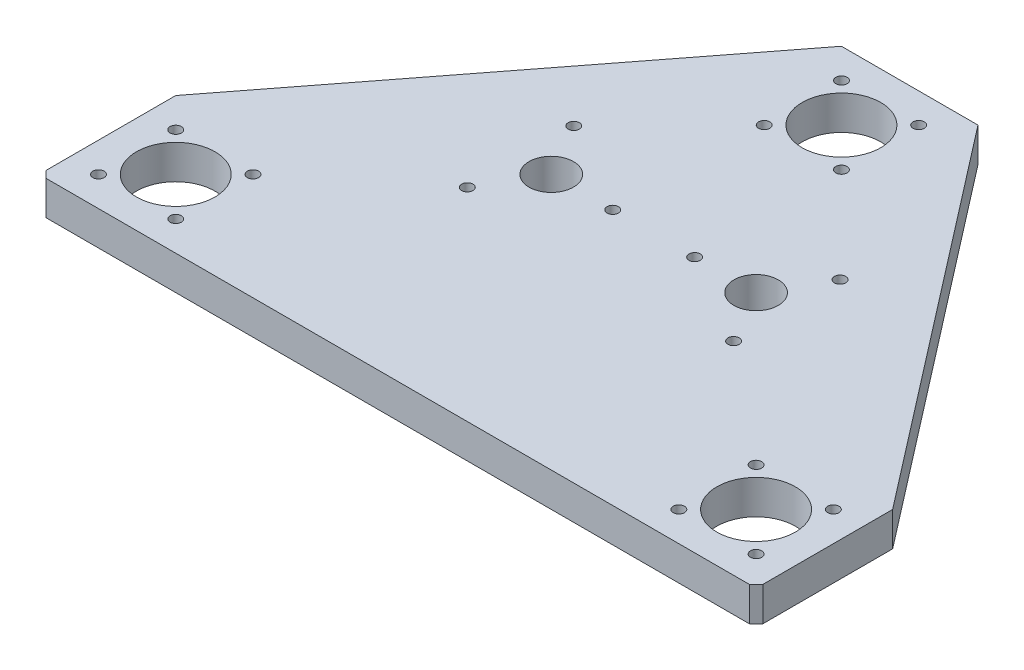
ISO-10303-21;
HEADER;
FILE_DESCRIPTION(('STEP AP214'),'2;1');
FILE_NAME('part.step','',(''),(''),'','','');
FILE_SCHEMA(('AUTOMOTIVE_DESIGN { 1 0 10303 214 1 1 1 1 }'));
ENDSEC;
DATA;
#1=APPLICATION_CONTEXT('core data for automotive mechanical design processes');
#2=APPLICATION_PROTOCOL_DEFINITION('international standard','automotive_design',2000,#1);
#3=PRODUCT_CONTEXT('',#1,'mechanical');
#4=PRODUCT('Part','Part','',(#3));
#5=PRODUCT_RELATED_PRODUCT_CATEGORY('part','',(#4));
#6=PRODUCT_DEFINITION_FORMATION('','',#4);
#7=PRODUCT_DEFINITION_CONTEXT('part definition',#1,'design');
#8=PRODUCT_DEFINITION('design','',#6,#7);
#9=PRODUCT_DEFINITION_SHAPE('','',#8);
#10=(LENGTH_UNIT() NAMED_UNIT(*) SI_UNIT(.MILLI.,.METRE.));
#11=(NAMED_UNIT(*) PLANE_ANGLE_UNIT() SI_UNIT($,.RADIAN.));
#12=(NAMED_UNIT(*) SI_UNIT($,.STERADIAN.) SOLID_ANGLE_UNIT());
#13=UNCERTAINTY_MEASURE_WITH_UNIT(LENGTH_MEASURE(1.E-05),#10,'distance_accuracy_value','');
#14=(GEOMETRIC_REPRESENTATION_CONTEXT(3) GLOBAL_UNCERTAINTY_ASSIGNED_CONTEXT((#13)) GLOBAL_UNIT_ASSIGNED_CONTEXT((#10,
#11,#12)) REPRESENTATION_CONTEXT('',''));
#15=CARTESIAN_POINT('',(0.,0.,0.));
#16=DIRECTION('',(0.,0.,1.));
#17=DIRECTION('',(1.,0.,0.));
#18=AXIS2_PLACEMENT_3D('',#15,#16,#17);
#19=CARTESIAN_POINT('',(0.,10.,0.));
#20=DIRECTION('',(0.,1.,0.));
#21=DIRECTION('',(0.,0.,1.));
#22=AXIS2_PLACEMENT_3D('',#19,#20,#21);
#23=PLANE('',#22);
#24=CARTESIAN_POINT('',(38.9999999999999,10.,-15.58845726812));
#25=DIRECTION('',(0.,1.,0.));
#26=DIRECTION('',(0.,0.,1.));
#27=AXIS2_PLACEMENT_3D('',#24,#25,#26);
#28=CIRCLE('',#27,1.64999999999999);
#29=CARTESIAN_POINT('',(38.9999999999999,10.,-13.93845726812));
#30=VERTEX_POINT('',#29);
#31=EDGE_CURVE('E301',#30,#30,#28,.T.);
#32=ORIENTED_EDGE('',*,*,#31,.F.);
#33=EDGE_LOOP('',(#32));
#34=FACE_BOUND('',#33,.T.);
#35=CARTESIAN_POINT('',(39.0000000000001,10.,15.5884572681199));
#36=DIRECTION('',(0.,1.,0.));
#37=DIRECTION('',(0.,0.,1.));
#38=AXIS2_PLACEMENT_3D('',#35,#36,#37);
#39=CIRCLE('',#38,1.64999999999999);
#40=CARTESIAN_POINT('',(39.0000000000001,10.,17.2384572681199));
#41=VERTEX_POINT('',#40);
#42=EDGE_CURVE('E303',#41,#41,#39,.T.);
#43=ORIENTED_EDGE('',*,*,#42,.F.);
#44=EDGE_LOOP('',(#43));
#45=FACE_BOUND('',#44,.T.);
#46=CARTESIAN_POINT('',(12.,10.,0.));
#47=DIRECTION('',(0.,1.,0.));
#48=DIRECTION('',(0.,0.,1.));
#49=AXIS2_PLACEMENT_3D('',#46,#47,#48);
#50=CIRCLE('',#49,1.64999999999999);
#51=CARTESIAN_POINT('',(12.,10.,1.64999999999999));
#52=VERTEX_POINT('',#51);
#53=EDGE_CURVE('E311',#52,#52,#50,.T.);
#54=ORIENTED_EDGE('',*,*,#53,.F.);
#55=EDGE_LOOP('',(#54));
#56=FACE_BOUND('',#55,.T.);
#57=CARTESIAN_POINT('',(96.3137084989848,10.,43.6862915010152));
#58=DIRECTION('',(0.,1.,0.));
#59=DIRECTION('',(0.,0.,1.));
#60=AXIS2_PLACEMENT_3D('',#57,#58,#59);
#61=CIRCLE('',#60,1.65);
#62=CARTESIAN_POINT('',(96.3137084989848,10.,45.3362915010152));
#63=VERTEX_POINT('',#62);
#64=EDGE_CURVE('E317',#63,#63,#61,.T.);
#65=ORIENTED_EDGE('',*,*,#64,.F.);
#66=EDGE_LOOP('',(#65));
#67=FACE_BOUND('',#66,.T.);
#68=CARTESIAN_POINT('',(73.6862915010153,10.,43.6862915010152));
#69=DIRECTION('',(0.,1.,0.));
#70=DIRECTION('',(0.,0.,1.));
#71=AXIS2_PLACEMENT_3D('',#68,#69,#70);
#72=CIRCLE('',#71,1.65);
#73=CARTESIAN_POINT('',(73.6862915010153,10.,45.3362915010152));
#74=VERTEX_POINT('',#73);
#75=EDGE_CURVE('E323',#74,#74,#72,.T.);
#76=ORIENTED_EDGE('',*,*,#75,.F.);
#77=EDGE_LOOP('',(#76));
#78=FACE_BOUND('',#77,.T.);
#79=CARTESIAN_POINT('',(73.6862915010153,10.,66.3137084989848));
#80=DIRECTION('',(0.,1.,0.));
#81=DIRECTION('',(0.,0.,1.));
#82=AXIS2_PLACEMENT_3D('',#79,#80,#81);
#83=CIRCLE('',#82,1.65);
#84=CARTESIAN_POINT('',(73.6862915010153,10.,67.9637084989848));
#85=VERTEX_POINT('',#84);
#86=EDGE_CURVE('E329',#85,#85,#83,.T.);
#87=ORIENTED_EDGE('',*,*,#86,.F.);
#88=EDGE_LOOP('',(#87));
#89=FACE_BOUND('',#88,.T.);
#90=CARTESIAN_POINT('',(96.3137084989848,10.,66.3137084989848));
#91=DIRECTION('',(0.,1.,0.));
#92=DIRECTION('',(0.,0.,1.));
#93=AXIS2_PLACEMENT_3D('',#90,#91,#92);
#94=CIRCLE('',#93,1.65);
#95=CARTESIAN_POINT('',(96.3137084989848,10.,67.9637084989848));
#96=VERTEX_POINT('',#95);
#97=EDGE_CURVE('E335',#96,#96,#94,.T.);
#98=ORIENTED_EDGE('',*,*,#97,.F.);
#99=EDGE_LOOP('',(#98));
#100=FACE_BOUND('',#99,.T.);
#101=CARTESIAN_POINT('',(11.3137084989848,10.,-43.6862915010153));
#102=DIRECTION('',(0.,1.,0.));
#103=DIRECTION('',(0.,0.,1.));
#104=AXIS2_PLACEMENT_3D('',#101,#102,#103);
#105=CIRCLE('',#104,1.65);
#106=CARTESIAN_POINT('',(11.3137084989848,10.,-42.0362915010153));
#107=VERTEX_POINT('',#106);
#108=EDGE_CURVE('E341',#107,#107,#105,.T.);
#109=ORIENTED_EDGE('',*,*,#108,.F.);
#110=EDGE_LOOP('',(#109));
#111=FACE_BOUND('',#110,.T.);
#112=CARTESIAN_POINT('',(11.3137084989848,10.,-66.3137084989848));
#113=DIRECTION('',(0.,1.,0.));
#114=DIRECTION('',(0.,0.,1.));
#115=AXIS2_PLACEMENT_3D('',#112,#113,#114);
#116=CIRCLE('',#115,1.65);
#117=CARTESIAN_POINT('',(11.3137084989848,10.,-64.6637084989848));
#118=VERTEX_POINT('',#117);
#119=EDGE_CURVE('E347',#118,#118,#116,.T.);
#120=ORIENTED_EDGE('',*,*,#119,.F.);
#121=EDGE_LOOP('',(#120));
#122=FACE_BOUND('',#121,.T.);
#123=CARTESIAN_POINT('',(-38.9999999999999,10.,-15.58845726812));
#124=DIRECTION('',(0.,1.,0.));
#125=DIRECTION('',(0.,0.,1.));
#126=AXIS2_PLACEMENT_3D('',#123,#124,#125);
#127=CIRCLE('',#126,1.64999999999999);
#128=CARTESIAN_POINT('',(-38.9999999999999,10.,-13.93845726812));
#129=VERTEX_POINT('',#128);
#130=EDGE_CURVE('E353',#129,#129,#127,.T.);
#131=ORIENTED_EDGE('',*,*,#130,.F.);
#132=EDGE_LOOP('',(#131));
#133=FACE_BOUND('',#132,.T.);
#134=CARTESIAN_POINT('',(-39.0000000000001,10.,15.5884572681199));
#135=DIRECTION('',(0.,1.,0.));
#136=DIRECTION('',(0.,0.,1.));
#137=AXIS2_PLACEMENT_3D('',#134,#135,#136);
#138=CIRCLE('',#137,1.64999999999999);
#139=CARTESIAN_POINT('',(-39.0000000000001,10.,17.2384572681199));
#140=VERTEX_POINT('',#139);
#141=EDGE_CURVE('E359',#140,#140,#138,.T.);
#142=ORIENTED_EDGE('',*,*,#141,.F.);
#143=EDGE_LOOP('',(#142));
#144=FACE_BOUND('',#143,.T.);
#145=CARTESIAN_POINT('',(-12.,10.,0.));
#146=DIRECTION('',(0.,1.,0.));
#147=DIRECTION('',(0.,0.,1.));
#148=AXIS2_PLACEMENT_3D('',#145,#146,#147);
#149=CIRCLE('',#148,1.64999999999999);
#150=CARTESIAN_POINT('',(-12.,10.,1.64999999999999));
#151=VERTEX_POINT('',#150);
#152=EDGE_CURVE('E365',#151,#151,#149,.T.);
#153=ORIENTED_EDGE('',*,*,#152,.F.);
#154=EDGE_LOOP('',(#153));
#155=FACE_BOUND('',#154,.T.);
#156=CARTESIAN_POINT('',(-96.3137084989848,10.,43.6862915010152));
#157=DIRECTION('',(0.,1.,0.));
#158=DIRECTION('',(0.,0.,1.));
#159=AXIS2_PLACEMENT_3D('',#156,#157,#158);
#160=CIRCLE('',#159,1.65);
#161=CARTESIAN_POINT('',(-96.3137084989848,10.,45.3362915010152));
#162=VERTEX_POINT('',#161);
#163=EDGE_CURVE('E371',#162,#162,#160,.T.);
#164=ORIENTED_EDGE('',*,*,#163,.F.);
#165=EDGE_LOOP('',(#164));
#166=FACE_BOUND('',#165,.T.);
#167=CARTESIAN_POINT('',(-73.6862915010153,10.,43.6862915010152));
#168=DIRECTION('',(0.,1.,0.));
#169=DIRECTION('',(0.,0.,1.));
#170=AXIS2_PLACEMENT_3D('',#167,#168,#169);
#171=CIRCLE('',#170,1.65);
#172=CARTESIAN_POINT('',(-73.6862915010153,10.,45.3362915010152));
#173=VERTEX_POINT('',#172);
#174=EDGE_CURVE('E377',#173,#173,#171,.T.);
#175=ORIENTED_EDGE('',*,*,#174,.F.);
#176=EDGE_LOOP('',(#175));
#177=FACE_BOUND('',#176,.T.);
#178=CARTESIAN_POINT('',(-73.6862915010153,10.,66.3137084989848));
#179=DIRECTION('',(0.,1.,0.));
#180=DIRECTION('',(0.,0.,1.));
#181=AXIS2_PLACEMENT_3D('',#178,#179,#180);
#182=CIRCLE('',#181,1.65);
#183=CARTESIAN_POINT('',(-73.6862915010153,10.,67.9637084989848));
#184=VERTEX_POINT('',#183);
#185=EDGE_CURVE('E383',#184,#184,#182,.T.);
#186=ORIENTED_EDGE('',*,*,#185,.F.);
#187=EDGE_LOOP('',(#186));
#188=FACE_BOUND('',#187,.T.);
#189=CARTESIAN_POINT('',(-96.3137084989848,10.,66.3137084989848));
#190=DIRECTION('',(0.,1.,0.));
#191=DIRECTION('',(0.,0.,1.));
#192=AXIS2_PLACEMENT_3D('',#189,#190,#191);
#193=CIRCLE('',#192,1.65);
#194=CARTESIAN_POINT('',(-96.3137084989848,10.,67.9637084989848));
#195=VERTEX_POINT('',#194);
#196=EDGE_CURVE('E389',#195,#195,#193,.T.);
#197=ORIENTED_EDGE('',*,*,#196,.F.);
#198=EDGE_LOOP('',(#197));
#199=FACE_BOUND('',#198,.T.);
#200=CARTESIAN_POINT('',(-11.3137084989848,10.,-43.6862915010153));
#201=DIRECTION('',(0.,1.,0.));
#202=DIRECTION('',(0.,0.,1.));
#203=AXIS2_PLACEMENT_3D('',#200,#201,#202);
#204=CIRCLE('',#203,1.65);
#205=CARTESIAN_POINT('',(-11.3137084989848,10.,-42.0362915010153));
#206=VERTEX_POINT('',#205);
#207=EDGE_CURVE('E395',#206,#206,#204,.T.);
#208=ORIENTED_EDGE('',*,*,#207,.F.);
#209=EDGE_LOOP('',(#208));
#210=FACE_BOUND('',#209,.T.);
#211=CARTESIAN_POINT('',(-11.3137084989848,10.,-66.3137084989848));
#212=DIRECTION('',(0.,1.,0.));
#213=DIRECTION('',(0.,0.,1.));
#214=AXIS2_PLACEMENT_3D('',#211,#212,#213);
#215=CIRCLE('',#214,1.65);
#216=CARTESIAN_POINT('',(-11.3137084989848,10.,-64.6637084989848));
#217=VERTEX_POINT('',#216);
#218=EDGE_CURVE('E401',#217,#217,#215,.T.);
#219=ORIENTED_EDGE('',*,*,#218,.F.);
#220=EDGE_LOOP('',(#219));
#221=FACE_BOUND('',#220,.T.);
#222=CARTESIAN_POINT('',(85.,10.,55.));
#223=DIRECTION('',(0.,1.,0.));
#224=DIRECTION('',(0.,0.,1.));
#225=AXIS2_PLACEMENT_3D('',#222,#223,#224);
#226=CIRCLE('',#225,11.5);
#227=CARTESIAN_POINT('',(85.,10.,66.5));
#228=VERTEX_POINT('',#227);
#229=EDGE_CURVE('E414',#228,#228,#226,.T.);
#230=ORIENTED_EDGE('',*,*,#229,.F.);
#231=EDGE_LOOP('',(#230));
#232=FACE_BOUND('',#231,.T.);
#233=CARTESIAN_POINT('',(30.,10.,0.));
#234=DIRECTION('',(0.,1.,0.));
#235=DIRECTION('',(0.,0.,1.));
#236=AXIS2_PLACEMENT_3D('',#233,#234,#235);
#237=CIRCLE('',#236,6.5);
#238=CARTESIAN_POINT('',(30.,10.,6.5));
#239=VERTEX_POINT('',#238);
#240=EDGE_CURVE('E426',#239,#239,#237,.T.);
#241=ORIENTED_EDGE('',*,*,#240,.F.);
#242=EDGE_LOOP('',(#241));
#243=FACE_BOUND('',#242,.T.);
#244=DIRECTION('',(1.,0.,0.));
#245=VECTOR('',#244,1.);
#246=CARTESIAN_POINT('',(-65.,10.,75.));
#247=LINE('',#246,#245);
#248=CARTESIAN_POINT('',(-103.,10.,75.));
#249=VERTEX_POINT('',#248);
#250=CARTESIAN_POINT('',(103.,10.,75.));
#251=VERTEX_POINT('',#250);
#252=EDGE_CURVE('E112',#249,#251,#247,.T.);
#253=ORIENTED_EDGE('',*,*,#252,.T.);
#254=DIRECTION('',(-0.707106781186552,0.,0.707106781186543));
#255=VECTOR('',#254,1.);
#256=CARTESIAN_POINT('',(88.9999999999993,10.,89.0000000000005));
#257=LINE('',#256,#255);
#258=CARTESIAN_POINT('',(105.,10.,73.));
#259=VERTEX_POINT('',#258);
#260=EDGE_CURVE('E44',#251,#259,#257,.F.);
#261=ORIENTED_EDGE('',*,*,#260,.T.);
#262=DIRECTION('',(0.,0.,-1.));
#263=VECTOR('',#262,1.);
#264=CARTESIAN_POINT('',(105.,10.,75.));
#265=LINE('',#264,#263);
#266=CARTESIAN_POINT('',(105.,10.,35.));
#267=VERTEX_POINT('',#266);
#268=EDGE_CURVE('E102',#259,#267,#265,.T.);
#269=ORIENTED_EDGE('',*,*,#268,.T.);
#270=DIRECTION('',(-0.611447501075765,0.,-0.791285001392167));
#271=VECTOR('',#270,1.);
#272=CARTESIAN_POINT('',(20.,10.,-75.));
#273=LINE('',#272,#271);
#274=CARTESIAN_POINT('',(20.,10.,-75.));
#275=VERTEX_POINT('',#274);
#276=EDGE_CURVE('E106',#267,#275,#273,.T.);
#277=ORIENTED_EDGE('',*,*,#276,.T.);
#278=DIRECTION('',(-1.,0.,0.));
#279=VECTOR('',#278,1.);
#280=CARTESIAN_POINT('',(20.,10.,-75.));
#281=LINE('',#280,#279);
#282=CARTESIAN_POINT('',(-20.,10.,-75.));
#283=VERTEX_POINT('',#282);
#284=EDGE_CURVE('E127',#275,#283,#281,.T.);
#285=ORIENTED_EDGE('',*,*,#284,.T.);
#286=DIRECTION('',(-0.611447501075766,0.,0.791285001392167));
#287=VECTOR('',#286,1.);
#288=CARTESIAN_POINT('',(-105.,10.,35.));
#289=LINE('',#288,#287);
#290=CARTESIAN_POINT('',(-105.,10.,35.));
#291=VERTEX_POINT('',#290);
#292=EDGE_CURVE('E129',#283,#291,#289,.T.);
#293=ORIENTED_EDGE('',*,*,#292,.T.);
#294=DIRECTION('',(0.,0.,1.));
#295=VECTOR('',#294,1.);
#296=CARTESIAN_POINT('',(-105.,10.,75.));
#297=LINE('',#296,#295);
#298=CARTESIAN_POINT('',(-105.,10.,73.));
#299=VERTEX_POINT('',#298);
#300=EDGE_CURVE('E147',#291,#299,#297,.T.);
#301=ORIENTED_EDGE('',*,*,#300,.T.);
#302=DIRECTION('',(-0.707106781186543,0.,-0.707106781186552));
#303=VECTOR('',#302,1.);
#304=CARTESIAN_POINT('',(-89.0000000000007,10.,88.9999999999995));
#305=LINE('',#304,#303);
#306=EDGE_CURVE('E163',#299,#249,#305,.F.);
#307=ORIENTED_EDGE('',*,*,#306,.T.);
#308=EDGE_LOOP('',(#253,#261,#269,#277,#285,#293,#301,#307));
#309=FACE_BOUND('',#308,.T.);
#310=CARTESIAN_POINT('',(-30.,10.,0.));
#311=DIRECTION('',(0.,1.,0.));
#312=DIRECTION('',(0.,0.,1.));
#313=AXIS2_PLACEMENT_3D('',#310,#311,#312);
#314=CIRCLE('',#313,6.5);
#315=CARTESIAN_POINT('',(-30.,10.,6.50000000000001));
#316=VERTEX_POINT('',#315);
#317=EDGE_CURVE('E138',#316,#316,#314,.T.);
#318=ORIENTED_EDGE('',*,*,#317,.F.);
#319=EDGE_LOOP('',(#318));
#320=FACE_BOUND('',#319,.T.);
#321=CARTESIAN_POINT('',(0.,10.,-55.));
#322=DIRECTION('',(0.,1.,0.));
#323=DIRECTION('',(0.,0.,1.));
#324=AXIS2_PLACEMENT_3D('',#321,#322,#323);
#325=CIRCLE('',#324,11.5);
#326=CARTESIAN_POINT('',(0.,10.,-43.5));
#327=VERTEX_POINT('',#326);
#328=EDGE_CURVE('E420',#327,#327,#325,.T.);
#329=ORIENTED_EDGE('',*,*,#328,.F.);
#330=EDGE_LOOP('',(#329));
#331=FACE_BOUND('',#330,.T.);
#332=CARTESIAN_POINT('',(-85.,10.,55.));
#333=DIRECTION('',(0.,1.,0.));
#334=DIRECTION('',(0.,0.,1.));
#335=AXIS2_PLACEMENT_3D('',#332,#333,#334);
#336=CIRCLE('',#335,11.5);
#337=CARTESIAN_POINT('',(-85.,10.,66.5));
#338=VERTEX_POINT('',#337);
#339=EDGE_CURVE('E408',#338,#338,#336,.T.);
#340=ORIENTED_EDGE('',*,*,#339,.F.);
#341=EDGE_LOOP('',(#340));
#342=FACE_BOUND('',#341,.T.);
#343=ADVANCED_FACE('F36',(#34,#45,#56,#67,#78,#89,#100,#111,#122,#133,#144,#155,#166,#177,#188,
#199,#210,#221,#232,#243,#309,#320,#331,#342),#23,.T.);
#344=CARTESIAN_POINT('',(0.,0.,0.));
#345=DIRECTION('',(0.,1.,0.));
#346=DIRECTION('',(0.,0.,1.));
#347=AXIS2_PLACEMENT_3D('',#344,#345,#346);
#348=PLANE('',#347);
#349=CARTESIAN_POINT('',(38.9999999999999,0.,-15.58845726812));
#350=DIRECTION('',(0.,1.,0.));
#351=DIRECTION('',(0.,0.,1.));
#352=AXIS2_PLACEMENT_3D('',#349,#350,#351);
#353=CIRCLE('',#352,1.64999999999999);
#354=CARTESIAN_POINT('',(38.9999999999999,0.,-13.93845726812));
#355=VERTEX_POINT('',#354);
#356=EDGE_CURVE('E299',#355,#355,#353,.T.);
#357=ORIENTED_EDGE('',*,*,#356,.T.);
#358=EDGE_LOOP('',(#357));
#359=FACE_BOUND('',#358,.T.);
#360=CARTESIAN_POINT('',(39.0000000000001,0.,15.5884572681199));
#361=DIRECTION('',(0.,1.,0.));
#362=DIRECTION('',(0.,0.,1.));
#363=AXIS2_PLACEMENT_3D('',#360,#361,#362);
#364=CIRCLE('',#363,1.64999999999999);
#365=CARTESIAN_POINT('',(39.0000000000001,0.,17.2384572681199));
#366=VERTEX_POINT('',#365);
#367=EDGE_CURVE('E308',#366,#366,#364,.T.);
#368=ORIENTED_EDGE('',*,*,#367,.T.);
#369=EDGE_LOOP('',(#368));
#370=FACE_BOUND('',#369,.T.);
#371=CARTESIAN_POINT('',(12.,0.,0.));
#372=DIRECTION('',(0.,1.,0.));
#373=DIRECTION('',(0.,0.,1.));
#374=AXIS2_PLACEMENT_3D('',#371,#372,#373);
#375=CIRCLE('',#374,1.64999999999999);
#376=CARTESIAN_POINT('',(12.,0.,1.64999999999999));
#377=VERTEX_POINT('',#376);
#378=EDGE_CURVE('E314',#377,#377,#375,.T.);
#379=ORIENTED_EDGE('',*,*,#378,.T.);
#380=EDGE_LOOP('',(#379));
#381=FACE_BOUND('',#380,.T.);
#382=CARTESIAN_POINT('',(96.3137084989848,0.,43.6862915010152));
#383=DIRECTION('',(0.,1.,0.));
#384=DIRECTION('',(0.,0.,1.));
#385=AXIS2_PLACEMENT_3D('',#382,#383,#384);
#386=CIRCLE('',#385,1.65);
#387=CARTESIAN_POINT('',(96.3137084989848,0.,45.3362915010152));
#388=VERTEX_POINT('',#387);
#389=EDGE_CURVE('E320',#388,#388,#386,.T.);
#390=ORIENTED_EDGE('',*,*,#389,.T.);
#391=EDGE_LOOP('',(#390));
#392=FACE_BOUND('',#391,.T.);
#393=CARTESIAN_POINT('',(73.6862915010153,0.,43.6862915010152));
#394=DIRECTION('',(0.,1.,0.));
#395=DIRECTION('',(0.,0.,1.));
#396=AXIS2_PLACEMENT_3D('',#393,#394,#395);
#397=CIRCLE('',#396,1.65);
#398=CARTESIAN_POINT('',(73.6862915010153,0.,45.3362915010152));
#399=VERTEX_POINT('',#398);
#400=EDGE_CURVE('E326',#399,#399,#397,.T.);
#401=ORIENTED_EDGE('',*,*,#400,.T.);
#402=EDGE_LOOP('',(#401));
#403=FACE_BOUND('',#402,.T.);
#404=CARTESIAN_POINT('',(73.6862915010153,0.,66.3137084989848));
#405=DIRECTION('',(0.,1.,0.));
#406=DIRECTION('',(0.,0.,1.));
#407=AXIS2_PLACEMENT_3D('',#404,#405,#406);
#408=CIRCLE('',#407,1.65);
#409=CARTESIAN_POINT('',(73.6862915010153,0.,67.9637084989848));
#410=VERTEX_POINT('',#409);
#411=EDGE_CURVE('E332',#410,#410,#408,.T.);
#412=ORIENTED_EDGE('',*,*,#411,.T.);
#413=EDGE_LOOP('',(#412));
#414=FACE_BOUND('',#413,.T.);
#415=CARTESIAN_POINT('',(96.3137084989848,0.,66.3137084989848));
#416=DIRECTION('',(0.,1.,0.));
#417=DIRECTION('',(0.,0.,1.));
#418=AXIS2_PLACEMENT_3D('',#415,#416,#417);
#419=CIRCLE('',#418,1.65);
#420=CARTESIAN_POINT('',(96.3137084989848,0.,67.9637084989848));
#421=VERTEX_POINT('',#420);
#422=EDGE_CURVE('E338',#421,#421,#419,.T.);
#423=ORIENTED_EDGE('',*,*,#422,.T.);
#424=EDGE_LOOP('',(#423));
#425=FACE_BOUND('',#424,.T.);
#426=CARTESIAN_POINT('',(11.3137084989848,0.,-43.6862915010153));
#427=DIRECTION('',(0.,1.,0.));
#428=DIRECTION('',(0.,0.,1.));
#429=AXIS2_PLACEMENT_3D('',#426,#427,#428);
#430=CIRCLE('',#429,1.65);
#431=CARTESIAN_POINT('',(11.3137084989848,0.,-42.0362915010153));
#432=VERTEX_POINT('',#431);
#433=EDGE_CURVE('E344',#432,#432,#430,.T.);
#434=ORIENTED_EDGE('',*,*,#433,.T.);
#435=EDGE_LOOP('',(#434));
#436=FACE_BOUND('',#435,.T.);
#437=CARTESIAN_POINT('',(11.3137084989848,0.,-66.3137084989848));
#438=DIRECTION('',(0.,1.,0.));
#439=DIRECTION('',(0.,0.,1.));
#440=AXIS2_PLACEMENT_3D('',#437,#438,#439);
#441=CIRCLE('',#440,1.65);
#442=CARTESIAN_POINT('',(11.3137084989848,0.,-64.6637084989848));
#443=VERTEX_POINT('',#442);
#444=EDGE_CURVE('E350',#443,#443,#441,.T.);
#445=ORIENTED_EDGE('',*,*,#444,.T.);
#446=EDGE_LOOP('',(#445));
#447=FACE_BOUND('',#446,.T.);
#448=CARTESIAN_POINT('',(-38.9999999999999,0.,-15.58845726812));
#449=DIRECTION('',(0.,1.,0.));
#450=DIRECTION('',(0.,0.,1.));
#451=AXIS2_PLACEMENT_3D('',#448,#449,#450);
#452=CIRCLE('',#451,1.64999999999999);
#453=CARTESIAN_POINT('',(-38.9999999999999,0.,-13.93845726812));
#454=VERTEX_POINT('',#453);
#455=EDGE_CURVE('E356',#454,#454,#452,.T.);
#456=ORIENTED_EDGE('',*,*,#455,.T.);
#457=EDGE_LOOP('',(#456));
#458=FACE_BOUND('',#457,.T.);
#459=CARTESIAN_POINT('',(-39.0000000000001,0.,15.5884572681199));
#460=DIRECTION('',(0.,1.,0.));
#461=DIRECTION('',(0.,0.,1.));
#462=AXIS2_PLACEMENT_3D('',#459,#460,#461);
#463=CIRCLE('',#462,1.64999999999999);
#464=CARTESIAN_POINT('',(-39.0000000000001,0.,17.2384572681199));
#465=VERTEX_POINT('',#464);
#466=EDGE_CURVE('E362',#465,#465,#463,.T.);
#467=ORIENTED_EDGE('',*,*,#466,.T.);
#468=EDGE_LOOP('',(#467));
#469=FACE_BOUND('',#468,.T.);
#470=CARTESIAN_POINT('',(-12.,0.,0.));
#471=DIRECTION('',(0.,1.,0.));
#472=DIRECTION('',(0.,0.,1.));
#473=AXIS2_PLACEMENT_3D('',#470,#471,#472);
#474=CIRCLE('',#473,1.64999999999999);
#475=CARTESIAN_POINT('',(-12.,0.,1.64999999999999));
#476=VERTEX_POINT('',#475);
#477=EDGE_CURVE('E368',#476,#476,#474,.T.);
#478=ORIENTED_EDGE('',*,*,#477,.T.);
#479=EDGE_LOOP('',(#478));
#480=FACE_BOUND('',#479,.T.);
#481=CARTESIAN_POINT('',(-96.3137084989848,0.,43.6862915010152));
#482=DIRECTION('',(0.,1.,0.));
#483=DIRECTION('',(0.,0.,1.));
#484=AXIS2_PLACEMENT_3D('',#481,#482,#483);
#485=CIRCLE('',#484,1.65);
#486=CARTESIAN_POINT('',(-96.3137084989848,0.,45.3362915010152));
#487=VERTEX_POINT('',#486);
#488=EDGE_CURVE('E374',#487,#487,#485,.T.);
#489=ORIENTED_EDGE('',*,*,#488,.T.);
#490=EDGE_LOOP('',(#489));
#491=FACE_BOUND('',#490,.T.);
#492=CARTESIAN_POINT('',(-73.6862915010153,0.,43.6862915010152));
#493=DIRECTION('',(0.,1.,0.));
#494=DIRECTION('',(0.,0.,1.));
#495=AXIS2_PLACEMENT_3D('',#492,#493,#494);
#496=CIRCLE('',#495,1.65);
#497=CARTESIAN_POINT('',(-73.6862915010153,0.,45.3362915010152));
#498=VERTEX_POINT('',#497);
#499=EDGE_CURVE('E380',#498,#498,#496,.T.);
#500=ORIENTED_EDGE('',*,*,#499,.T.);
#501=EDGE_LOOP('',(#500));
#502=FACE_BOUND('',#501,.T.);
#503=CARTESIAN_POINT('',(-73.6862915010153,0.,66.3137084989848));
#504=DIRECTION('',(0.,1.,0.));
#505=DIRECTION('',(0.,0.,1.));
#506=AXIS2_PLACEMENT_3D('',#503,#504,#505);
#507=CIRCLE('',#506,1.65);
#508=CARTESIAN_POINT('',(-73.6862915010153,0.,67.9637084989848));
#509=VERTEX_POINT('',#508);
#510=EDGE_CURVE('E386',#509,#509,#507,.T.);
#511=ORIENTED_EDGE('',*,*,#510,.T.);
#512=EDGE_LOOP('',(#511));
#513=FACE_BOUND('',#512,.T.);
#514=CARTESIAN_POINT('',(-96.3137084989848,0.,66.3137084989848));
#515=DIRECTION('',(0.,1.,0.));
#516=DIRECTION('',(0.,0.,1.));
#517=AXIS2_PLACEMENT_3D('',#514,#515,#516);
#518=CIRCLE('',#517,1.65);
#519=CARTESIAN_POINT('',(-96.3137084989848,0.,67.9637084989848));
#520=VERTEX_POINT('',#519);
#521=EDGE_CURVE('E392',#520,#520,#518,.T.);
#522=ORIENTED_EDGE('',*,*,#521,.T.);
#523=EDGE_LOOP('',(#522));
#524=FACE_BOUND('',#523,.T.);
#525=CARTESIAN_POINT('',(-11.3137084989848,0.,-43.6862915010153));
#526=DIRECTION('',(0.,1.,0.));
#527=DIRECTION('',(0.,0.,1.));
#528=AXIS2_PLACEMENT_3D('',#525,#526,#527);
#529=CIRCLE('',#528,1.65);
#530=CARTESIAN_POINT('',(-11.3137084989848,0.,-42.0362915010153));
#531=VERTEX_POINT('',#530);
#532=EDGE_CURVE('E398',#531,#531,#529,.T.);
#533=ORIENTED_EDGE('',*,*,#532,.T.);
#534=EDGE_LOOP('',(#533));
#535=FACE_BOUND('',#534,.T.);
#536=CARTESIAN_POINT('',(-11.3137084989848,0.,-66.3137084989848));
#537=DIRECTION('',(0.,1.,0.));
#538=DIRECTION('',(0.,0.,1.));
#539=AXIS2_PLACEMENT_3D('',#536,#537,#538);
#540=CIRCLE('',#539,1.65);
#541=CARTESIAN_POINT('',(-11.3137084989848,0.,-64.6637084989848));
#542=VERTEX_POINT('',#541);
#543=EDGE_CURVE('E404',#542,#542,#540,.T.);
#544=ORIENTED_EDGE('',*,*,#543,.T.);
#545=EDGE_LOOP('',(#544));
#546=FACE_BOUND('',#545,.T.);
#547=DIRECTION('',(0.,0.,-1.));
#548=VECTOR('',#547,1.);
#549=CARTESIAN_POINT('',(105.,0.,75.));
#550=LINE('',#549,#548);
#551=CARTESIAN_POINT('',(105.,0.,73.));
#552=VERTEX_POINT('',#551);
#553=CARTESIAN_POINT('',(105.,0.,35.));
#554=VERTEX_POINT('',#553);
#555=EDGE_CURVE('E118',#552,#554,#550,.T.);
#556=ORIENTED_EDGE('',*,*,#555,.F.);
#557=DIRECTION('',(0.707106781186552,0.,-0.707106781186543));
#558=VECTOR('',#557,1.);
#559=CARTESIAN_POINT('',(105.,0.,73.));
#560=LINE('',#559,#558);
#561=CARTESIAN_POINT('',(103.,0.,75.));
#562=VERTEX_POINT('',#561);
#563=EDGE_CURVE('E157',#552,#562,#560,.F.);
#564=ORIENTED_EDGE('',*,*,#563,.T.);
#565=DIRECTION('',(1.,0.,0.));
#566=VECTOR('',#565,1.);
#567=CARTESIAN_POINT('',(105.,0.,75.));
#568=LINE('',#567,#566);
#569=CARTESIAN_POINT('',(-103.,0.,75.));
#570=VERTEX_POINT('',#569);
#571=EDGE_CURVE('E137',#570,#562,#568,.T.);
#572=ORIENTED_EDGE('',*,*,#571,.F.);
#573=DIRECTION('',(0.707106781186543,0.,0.707106781186552));
#574=VECTOR('',#573,1.);
#575=CARTESIAN_POINT('',(-103.,0.,75.));
#576=LINE('',#575,#574);
#577=CARTESIAN_POINT('',(-105.,0.,73.));
#578=VERTEX_POINT('',#577);
#579=EDGE_CURVE('E155',#570,#578,#576,.F.);
#580=ORIENTED_EDGE('',*,*,#579,.T.);
#581=DIRECTION('',(0.,0.,1.));
#582=VECTOR('',#581,1.);
#583=CARTESIAN_POINT('',(-105.,0.,75.));
#584=LINE('',#583,#582);
#585=CARTESIAN_POINT('',(-105.,0.,35.));
#586=VERTEX_POINT('',#585);
#587=EDGE_CURVE('E135',#586,#578,#584,.T.);
#588=ORIENTED_EDGE('',*,*,#587,.F.);
#589=DIRECTION('',(-0.611447501075766,0.,0.791285001392167));
#590=VECTOR('',#589,1.);
#591=CARTESIAN_POINT('',(-105.,0.,35.));
#592=LINE('',#591,#590);
#593=CARTESIAN_POINT('',(-20.,0.,-75.));
#594=VERTEX_POINT('',#593);
#595=EDGE_CURVE('E145',#594,#586,#592,.T.);
#596=ORIENTED_EDGE('',*,*,#595,.F.);
#597=DIRECTION('',(-1.,0.,0.));
#598=VECTOR('',#597,1.);
#599=CARTESIAN_POINT('',(20.,0.,-75.));
#600=LINE('',#599,#598);
#601=CARTESIAN_POINT('',(20.,0.,-75.));
#602=VERTEX_POINT('',#601);
#603=EDGE_CURVE('E143',#602,#594,#600,.T.);
#604=ORIENTED_EDGE('',*,*,#603,.F.);
#605=DIRECTION('',(-0.611447501075765,0.,-0.791285001392167));
#606=VECTOR('',#605,1.);
#607=CARTESIAN_POINT('',(20.,0.,-75.));
#608=LINE('',#607,#606);
#609=EDGE_CURVE('E141',#554,#602,#608,.T.);
#610=ORIENTED_EDGE('',*,*,#609,.F.);
#611=EDGE_LOOP('',(#556,#564,#572,#580,#588,#596,#604,#610));
#612=FACE_BOUND('',#611,.T.);
#613=CARTESIAN_POINT('',(-30.,0.,0.));
#614=DIRECTION('',(0.,1.,0.));
#615=DIRECTION('',(0.,0.,1.));
#616=AXIS2_PLACEMENT_3D('',#613,#614,#615);
#617=CIRCLE('',#616,6.5);
#618=CARTESIAN_POINT('',(-30.,0.,6.50000000000001));
#619=VERTEX_POINT('',#618);
#620=EDGE_CURVE('E429',#619,#619,#617,.T.);
#621=ORIENTED_EDGE('',*,*,#620,.T.);
#622=EDGE_LOOP('',(#621));
#623=FACE_BOUND('',#622,.T.);
#624=CARTESIAN_POINT('',(30.,0.,0.));
#625=DIRECTION('',(0.,1.,0.));
#626=DIRECTION('',(0.,0.,1.));
#627=AXIS2_PLACEMENT_3D('',#624,#625,#626);
#628=CIRCLE('',#627,6.5);
#629=CARTESIAN_POINT('',(30.,0.,6.5));
#630=VERTEX_POINT('',#629);
#631=EDGE_CURVE('E423',#630,#630,#628,.T.);
#632=ORIENTED_EDGE('',*,*,#631,.T.);
#633=EDGE_LOOP('',(#632));
#634=FACE_BOUND('',#633,.T.);
#635=CARTESIAN_POINT('',(0.,0.,-55.));
#636=DIRECTION('',(0.,1.,0.));
#637=DIRECTION('',(0.,0.,1.));
#638=AXIS2_PLACEMENT_3D('',#635,#636,#637);
#639=CIRCLE('',#638,11.5);
#640=CARTESIAN_POINT('',(0.,0.,-43.5));
#641=VERTEX_POINT('',#640);
#642=EDGE_CURVE('E417',#641,#641,#639,.T.);
#643=ORIENTED_EDGE('',*,*,#642,.T.);
#644=EDGE_LOOP('',(#643));
#645=FACE_BOUND('',#644,.T.);
#646=CARTESIAN_POINT('',(85.,0.,55.));
#647=DIRECTION('',(0.,1.,0.));
#648=DIRECTION('',(0.,0.,1.));
#649=AXIS2_PLACEMENT_3D('',#646,#647,#648);
#650=CIRCLE('',#649,11.5);
#651=CARTESIAN_POINT('',(85.,0.,66.5));
#652=VERTEX_POINT('',#651);
#653=EDGE_CURVE('E411',#652,#652,#650,.T.);
#654=ORIENTED_EDGE('',*,*,#653,.T.);
#655=EDGE_LOOP('',(#654));
#656=FACE_BOUND('',#655,.T.);
#657=CARTESIAN_POINT('',(-85.,0.,55.));
#658=DIRECTION('',(0.,1.,0.));
#659=DIRECTION('',(0.,0.,1.));
#660=AXIS2_PLACEMENT_3D('',#657,#658,#659);
#661=CIRCLE('',#660,11.5);
#662=CARTESIAN_POINT('',(-85.,0.,66.5));
#663=VERTEX_POINT('',#662);
#664=EDGE_CURVE('E407',#663,#663,#661,.T.);
#665=ORIENTED_EDGE('',*,*,#664,.T.);
#666=EDGE_LOOP('',(#665));
#667=FACE_BOUND('',#666,.T.);
#668=ADVANCED_FACE('F171',(#359,#370,#381,#392,#403,#414,#425,#436,#447,#458,#469,#480,#491,
#502,#513,#524,#535,#546,#612,#623,#634,#645,#656,#667),#348,.F.);
#669=CARTESIAN_POINT('',(-105.,10.,75.));
#670=DIRECTION('',(1.,0.,0.));
#671=DIRECTION('',(0.,0.,-1.));
#672=AXIS2_PLACEMENT_3D('',#669,#670,#671);
#673=PLANE('',#672);
#674=ORIENTED_EDGE('',*,*,#587,.T.);
#675=DIRECTION('',(0.,1.,0.));
#676=VECTOR('',#675,1.);
#677=CARTESIAN_POINT('',(-105.,10.,73.));
#678=LINE('',#677,#676);
#679=EDGE_CURVE('E11',#578,#299,#678,.T.);
#680=ORIENTED_EDGE('',*,*,#679,.T.);
#681=ORIENTED_EDGE('',*,*,#300,.F.);
#682=DIRECTION('',(0.,-1.,0.));
#683=VECTOR('',#682,1.);
#684=CARTESIAN_POINT('',(-105.,10.,35.));
#685=LINE('',#684,#683);
#686=EDGE_CURVE('E134',#291,#586,#685,.T.);
#687=ORIENTED_EDGE('',*,*,#686,.T.);
#688=EDGE_LOOP('',(#674,#680,#681,#687));
#689=FACE_BOUND('',#688,.T.);
#690=ADVANCED_FACE('F174',(#689),#673,.F.);
#691=CARTESIAN_POINT('',(105.,10.,75.));
#692=DIRECTION('',(0.,0.,-1.));
#693=DIRECTION('',(-1.,0.,0.));
#694=AXIS2_PLACEMENT_3D('',#691,#692,#693);
#695=PLANE('',#694);
#696=ORIENTED_EDGE('',*,*,#571,.T.);
#697=DIRECTION('',(0.,1.,0.));
#698=VECTOR('',#697,1.);
#699=CARTESIAN_POINT('',(103.,10.,75.));
#700=LINE('',#699,#698);
#701=EDGE_CURVE('E57',#562,#251,#700,.T.);
#702=ORIENTED_EDGE('',*,*,#701,.T.);
#703=ORIENTED_EDGE('',*,*,#252,.F.);
#704=DIRECTION('',(0.,-1.,0.));
#705=VECTOR('',#704,1.);
#706=CARTESIAN_POINT('',(-103.,10.,75.));
#707=LINE('',#706,#705);
#708=EDGE_CURVE('E159',#249,#570,#707,.T.);
#709=ORIENTED_EDGE('',*,*,#708,.T.);
#710=EDGE_LOOP('',(#696,#702,#703,#709));
#711=FACE_BOUND('',#710,.T.);
#712=ADVANCED_FACE('F167',(#711),#695,.F.);
#713=CARTESIAN_POINT('',(105.,10.,75.));
#714=DIRECTION('',(-1.,0.,0.));
#715=DIRECTION('',(0.,0.,1.));
#716=AXIS2_PLACEMENT_3D('',#713,#714,#715);
#717=PLANE('',#716);
#718=ORIENTED_EDGE('',*,*,#268,.F.);
#719=DIRECTION('',(0.,-1.,0.));
#720=VECTOR('',#719,1.);
#721=CARTESIAN_POINT('',(105.,10.,73.));
#722=LINE('',#721,#720);
#723=EDGE_CURVE('E121',#259,#552,#722,.T.);
#724=ORIENTED_EDGE('',*,*,#723,.T.);
#725=ORIENTED_EDGE('',*,*,#555,.T.);
#726=DIRECTION('',(0.,-1.,0.));
#727=VECTOR('',#726,1.);
#728=CARTESIAN_POINT('',(105.,10.,35.));
#729=LINE('',#728,#727);
#730=EDGE_CURVE('E115',#267,#554,#729,.T.);
#731=ORIENTED_EDGE('',*,*,#730,.F.);
#732=EDGE_LOOP('',(#718,#724,#725,#731));
#733=FACE_BOUND('',#732,.T.);
#734=ADVANCED_FACE('F116',(#733),#717,.F.);
#735=CARTESIAN_POINT('',(20.,10.,-75.));
#736=DIRECTION('',(-0.791285001392167,0.,0.611447501075765));
#737=DIRECTION('',(0.611447501075765,0.,0.791285001392167));
#738=AXIS2_PLACEMENT_3D('',#735,#736,#737);
#739=PLANE('',#738);
#740=ORIENTED_EDGE('',*,*,#609,.T.);
#741=DIRECTION('',(0.,-1.,0.));
#742=VECTOR('',#741,1.);
#743=CARTESIAN_POINT('',(20.,10.,-75.));
#744=LINE('',#743,#742);
#745=EDGE_CURVE('E122',#275,#602,#744,.T.);
#746=ORIENTED_EDGE('',*,*,#745,.F.);
#747=ORIENTED_EDGE('',*,*,#276,.F.);
#748=ORIENTED_EDGE('',*,*,#730,.T.);
#749=EDGE_LOOP('',(#740,#746,#747,#748));
#750=FACE_BOUND('',#749,.T.);
#751=ADVANCED_FACE('F124',(#750),#739,.F.);
#752=CARTESIAN_POINT('',(20.,10.,-75.));
#753=DIRECTION('',(0.,0.,1.));
#754=DIRECTION('',(1.,0.,0.));
#755=AXIS2_PLACEMENT_3D('',#752,#753,#754);
#756=PLANE('',#755);
#757=ORIENTED_EDGE('',*,*,#603,.T.);
#758=DIRECTION('',(0.,-1.,0.));
#759=VECTOR('',#758,1.);
#760=CARTESIAN_POINT('',(-20.,10.,-75.));
#761=LINE('',#760,#759);
#762=EDGE_CURVE('E150',#283,#594,#761,.T.);
#763=ORIENTED_EDGE('',*,*,#762,.F.);
#764=ORIENTED_EDGE('',*,*,#284,.F.);
#765=ORIENTED_EDGE('',*,*,#745,.T.);
#766=EDGE_LOOP('',(#757,#763,#764,#765));
#767=FACE_BOUND('',#766,.T.);
#768=ADVANCED_FACE('F182',(#767),#756,.F.);
#769=CARTESIAN_POINT('',(-105.,10.,35.));
#770=DIRECTION('',(0.791285001392167,0.,0.611447501075766));
#771=DIRECTION('',(0.611447501075766,0.,-0.791285001392167));
#772=AXIS2_PLACEMENT_3D('',#769,#770,#771);
#773=PLANE('',#772);
#774=ORIENTED_EDGE('',*,*,#595,.T.);
#775=ORIENTED_EDGE('',*,*,#686,.F.);
#776=ORIENTED_EDGE('',*,*,#292,.F.);
#777=ORIENTED_EDGE('',*,*,#762,.T.);
#778=EDGE_LOOP('',(#774,#775,#776,#777));
#779=FACE_BOUND('',#778,.T.);
#780=ADVANCED_FACE('F178',(#779),#773,.F.);
#781=CARTESIAN_POINT('',(-30.,10.,0.));
#782=DIRECTION('',(0.,-1.,0.));
#783=DIRECTION('',(0.,0.,-1.));
#784=AXIS2_PLACEMENT_3D('',#781,#782,#783);
#785=CYLINDRICAL_SURFACE('',#784,6.5);
#786=ORIENTED_EDGE('',*,*,#317,.T.);
#787=EDGE_LOOP('',(#786));
#788=FACE_BOUND('',#787,.T.);
#789=ORIENTED_EDGE('',*,*,#620,.F.);
#790=EDGE_LOOP('',(#789));
#791=FACE_BOUND('',#790,.T.);
#792=ADVANCED_FACE('F189',(#788,#791),#785,.F.);
#793=CARTESIAN_POINT('',(30.,10.,0.));
#794=DIRECTION('',(0.,-1.,0.));
#795=DIRECTION('',(0.,0.,-1.));
#796=AXIS2_PLACEMENT_3D('',#793,#794,#795);
#797=CYLINDRICAL_SURFACE('',#796,6.5);
#798=ORIENTED_EDGE('',*,*,#240,.T.);
#799=EDGE_LOOP('',(#798));
#800=FACE_BOUND('',#799,.T.);
#801=ORIENTED_EDGE('',*,*,#631,.F.);
#802=EDGE_LOOP('',(#801));
#803=FACE_BOUND('',#802,.T.);
#804=ADVANCED_FACE('F205',(#800,#803),#797,.F.);
#805=CARTESIAN_POINT('',(0.,10.,-55.));
#806=DIRECTION('',(0.,-1.,0.));
#807=DIRECTION('',(0.,0.,-1.));
#808=AXIS2_PLACEMENT_3D('',#805,#806,#807);
#809=CYLINDRICAL_SURFACE('',#808,11.5);
#810=ORIENTED_EDGE('',*,*,#328,.T.);
#811=EDGE_LOOP('',(#810));
#812=FACE_BOUND('',#811,.T.);
#813=ORIENTED_EDGE('',*,*,#642,.F.);
#814=EDGE_LOOP('',(#813));
#815=FACE_BOUND('',#814,.T.);
#816=ADVANCED_FACE('F209',(#812,#815),#809,.F.);
#817=CARTESIAN_POINT('',(85.,10.,55.));
#818=DIRECTION('',(0.,-1.,0.));
#819=DIRECTION('',(0.,0.,-1.));
#820=AXIS2_PLACEMENT_3D('',#817,#818,#819);
#821=CYLINDRICAL_SURFACE('',#820,11.5);
#822=ORIENTED_EDGE('',*,*,#229,.T.);
#823=EDGE_LOOP('',(#822));
#824=FACE_BOUND('',#823,.T.);
#825=ORIENTED_EDGE('',*,*,#653,.F.);
#826=EDGE_LOOP('',(#825));
#827=FACE_BOUND('',#826,.T.);
#828=ADVANCED_FACE('F213',(#824,#827),#821,.F.);
#829=CARTESIAN_POINT('',(-85.,10.,55.));
#830=DIRECTION('',(0.,-1.,0.));
#831=DIRECTION('',(0.,0.,-1.));
#832=AXIS2_PLACEMENT_3D('',#829,#830,#831);
#833=CYLINDRICAL_SURFACE('',#832,11.5);
#834=ORIENTED_EDGE('',*,*,#339,.T.);
#835=EDGE_LOOP('',(#834));
#836=FACE_BOUND('',#835,.T.);
#837=ORIENTED_EDGE('',*,*,#664,.F.);
#838=EDGE_LOOP('',(#837));
#839=FACE_BOUND('',#838,.T.);
#840=ADVANCED_FACE('F217',(#836,#839),#833,.F.);
#841=CARTESIAN_POINT('',(105.,10.,73.));
#842=DIRECTION('',(-0.707106781186543,0.,-0.707106781186552));
#843=DIRECTION('',(0.,-1.,0.));
#844=AXIS2_PLACEMENT_3D('',#841,#842,#843);
#845=PLANE('',#844);
#846=ORIENTED_EDGE('',*,*,#260,.F.);
#847=ORIENTED_EDGE('',*,*,#701,.F.);
#848=ORIENTED_EDGE('',*,*,#563,.F.);
#849=ORIENTED_EDGE('',*,*,#723,.F.);
#850=EDGE_LOOP('',(#846,#847,#848,#849));
#851=FACE_BOUND('',#850,.T.);
#852=ADVANCED_FACE('F221',(#851),#845,.F.);
#853=CARTESIAN_POINT('',(-103.,10.,75.));
#854=DIRECTION('',(0.707106781186552,0.,-0.707106781186543));
#855=DIRECTION('',(0.,-1.,0.));
#856=AXIS2_PLACEMENT_3D('',#853,#854,#855);
#857=PLANE('',#856);
#858=ORIENTED_EDGE('',*,*,#306,.F.);
#859=ORIENTED_EDGE('',*,*,#679,.F.);
#860=ORIENTED_EDGE('',*,*,#579,.F.);
#861=ORIENTED_EDGE('',*,*,#708,.F.);
#862=EDGE_LOOP('',(#858,#859,#860,#861));
#863=FACE_BOUND('',#862,.T.);
#864=ADVANCED_FACE('F38',(#863),#857,.F.);
#865=CARTESIAN_POINT('',(-11.3137084989848,10.,-66.3137084989848));
#866=DIRECTION('',(0.,1.,0.));
#867=DIRECTION('',(0.,0.,1.));
#868=AXIS2_PLACEMENT_3D('',#865,#866,#867);
#869=CYLINDRICAL_SURFACE('',#868,1.65);
#870=ORIENTED_EDGE('',*,*,#543,.F.);
#871=EDGE_LOOP('',(#870));
#872=FACE_BOUND('',#871,.T.);
#873=ORIENTED_EDGE('',*,*,#218,.T.);
#874=EDGE_LOOP('',(#873));
#875=FACE_BOUND('',#874,.T.);
#876=ADVANCED_FACE('F223',(#872,#875),#869,.F.);
#877=CARTESIAN_POINT('',(-11.3137084989848,10.,-43.6862915010153));
#878=DIRECTION('',(0.,1.,0.));
#879=DIRECTION('',(0.,0.,1.));
#880=AXIS2_PLACEMENT_3D('',#877,#878,#879);
#881=CYLINDRICAL_SURFACE('',#880,1.65);
#882=ORIENTED_EDGE('',*,*,#532,.F.);
#883=EDGE_LOOP('',(#882));
#884=FACE_BOUND('',#883,.T.);
#885=ORIENTED_EDGE('',*,*,#207,.T.);
#886=EDGE_LOOP('',(#885));
#887=FACE_BOUND('',#886,.T.);
#888=ADVANCED_FACE('F226',(#884,#887),#881,.F.);
#889=CARTESIAN_POINT('',(-96.3137084989848,10.,66.3137084989848));
#890=DIRECTION('',(0.,1.,0.));
#891=DIRECTION('',(0.,0.,1.));
#892=AXIS2_PLACEMENT_3D('',#889,#890,#891);
#893=CYLINDRICAL_SURFACE('',#892,1.65);
#894=ORIENTED_EDGE('',*,*,#521,.F.);
#895=EDGE_LOOP('',(#894));
#896=FACE_BOUND('',#895,.T.);
#897=ORIENTED_EDGE('',*,*,#196,.T.);
#898=EDGE_LOOP('',(#897));
#899=FACE_BOUND('',#898,.T.);
#900=ADVANCED_FACE('F230',(#896,#899),#893,.F.);
#901=CARTESIAN_POINT('',(-73.6862915010153,10.,66.3137084989848));
#902=DIRECTION('',(0.,1.,0.));
#903=DIRECTION('',(0.,0.,1.));
#904=AXIS2_PLACEMENT_3D('',#901,#902,#903);
#905=CYLINDRICAL_SURFACE('',#904,1.65);
#906=ORIENTED_EDGE('',*,*,#510,.F.);
#907=EDGE_LOOP('',(#906));
#908=FACE_BOUND('',#907,.T.);
#909=ORIENTED_EDGE('',*,*,#185,.T.);
#910=EDGE_LOOP('',(#909));
#911=FACE_BOUND('',#910,.T.);
#912=ADVANCED_FACE('F234',(#908,#911),#905,.F.);
#913=CARTESIAN_POINT('',(-73.6862915010153,10.,43.6862915010152));
#914=DIRECTION('',(0.,1.,0.));
#915=DIRECTION('',(0.,0.,1.));
#916=AXIS2_PLACEMENT_3D('',#913,#914,#915);
#917=CYLINDRICAL_SURFACE('',#916,1.65);
#918=ORIENTED_EDGE('',*,*,#499,.F.);
#919=EDGE_LOOP('',(#918));
#920=FACE_BOUND('',#919,.T.);
#921=ORIENTED_EDGE('',*,*,#174,.T.);
#922=EDGE_LOOP('',(#921));
#923=FACE_BOUND('',#922,.T.);
#924=ADVANCED_FACE('F238',(#920,#923),#917,.F.);
#925=CARTESIAN_POINT('',(-96.3137084989848,10.,43.6862915010152));
#926=DIRECTION('',(0.,1.,0.));
#927=DIRECTION('',(0.,0.,1.));
#928=AXIS2_PLACEMENT_3D('',#925,#926,#927);
#929=CYLINDRICAL_SURFACE('',#928,1.65);
#930=ORIENTED_EDGE('',*,*,#488,.F.);
#931=EDGE_LOOP('',(#930));
#932=FACE_BOUND('',#931,.T.);
#933=ORIENTED_EDGE('',*,*,#163,.T.);
#934=EDGE_LOOP('',(#933));
#935=FACE_BOUND('',#934,.T.);
#936=ADVANCED_FACE('F242',(#932,#935),#929,.F.);
#937=CARTESIAN_POINT('',(-12.,10.,0.));
#938=DIRECTION('',(0.,1.,0.));
#939=DIRECTION('',(0.,0.,1.));
#940=AXIS2_PLACEMENT_3D('',#937,#938,#939);
#941=CYLINDRICAL_SURFACE('',#940,1.64999999999999);
#942=ORIENTED_EDGE('',*,*,#477,.F.);
#943=EDGE_LOOP('',(#942));
#944=FACE_BOUND('',#943,.T.);
#945=ORIENTED_EDGE('',*,*,#152,.T.);
#946=EDGE_LOOP('',(#945));
#947=FACE_BOUND('',#946,.T.);
#948=ADVANCED_FACE('F246',(#944,#947),#941,.F.);
#949=CARTESIAN_POINT('',(-39.0000000000001,10.,15.5884572681199));
#950=DIRECTION('',(0.,1.,0.));
#951=DIRECTION('',(0.,0.,1.));
#952=AXIS2_PLACEMENT_3D('',#949,#950,#951);
#953=CYLINDRICAL_SURFACE('',#952,1.64999999999999);
#954=ORIENTED_EDGE('',*,*,#466,.F.);
#955=EDGE_LOOP('',(#954));
#956=FACE_BOUND('',#955,.T.);
#957=ORIENTED_EDGE('',*,*,#141,.T.);
#958=EDGE_LOOP('',(#957));
#959=FACE_BOUND('',#958,.T.);
#960=ADVANCED_FACE('F250',(#956,#959),#953,.F.);
#961=CARTESIAN_POINT('',(-38.9999999999999,10.,-15.58845726812));
#962=DIRECTION('',(0.,1.,0.));
#963=DIRECTION('',(0.,0.,1.));
#964=AXIS2_PLACEMENT_3D('',#961,#962,#963);
#965=CYLINDRICAL_SURFACE('',#964,1.64999999999999);
#966=ORIENTED_EDGE('',*,*,#455,.F.);
#967=EDGE_LOOP('',(#966));
#968=FACE_BOUND('',#967,.T.);
#969=ORIENTED_EDGE('',*,*,#130,.T.);
#970=EDGE_LOOP('',(#969));
#971=FACE_BOUND('',#970,.T.);
#972=ADVANCED_FACE('F254',(#968,#971),#965,.F.);
#973=CARTESIAN_POINT('',(11.3137084989848,10.,-66.3137084989848));
#974=DIRECTION('',(0.,1.,0.));
#975=DIRECTION('',(0.,0.,1.));
#976=AXIS2_PLACEMENT_3D('',#973,#974,#975);
#977=CYLINDRICAL_SURFACE('',#976,1.65);
#978=ORIENTED_EDGE('',*,*,#444,.F.);
#979=EDGE_LOOP('',(#978));
#980=FACE_BOUND('',#979,.T.);
#981=ORIENTED_EDGE('',*,*,#119,.T.);
#982=EDGE_LOOP('',(#981));
#983=FACE_BOUND('',#982,.T.);
#984=ADVANCED_FACE('F258',(#980,#983),#977,.F.);
#985=CARTESIAN_POINT('',(11.3137084989848,10.,-43.6862915010153));
#986=DIRECTION('',(0.,1.,0.));
#987=DIRECTION('',(0.,0.,1.));
#988=AXIS2_PLACEMENT_3D('',#985,#986,#987);
#989=CYLINDRICAL_SURFACE('',#988,1.65);
#990=ORIENTED_EDGE('',*,*,#433,.F.);
#991=EDGE_LOOP('',(#990));
#992=FACE_BOUND('',#991,.T.);
#993=ORIENTED_EDGE('',*,*,#108,.T.);
#994=EDGE_LOOP('',(#993));
#995=FACE_BOUND('',#994,.T.);
#996=ADVANCED_FACE('F262',(#992,#995),#989,.F.);
#997=CARTESIAN_POINT('',(96.3137084989848,10.,66.3137084989848));
#998=DIRECTION('',(0.,1.,0.));
#999=DIRECTION('',(0.,0.,1.));
#1000=AXIS2_PLACEMENT_3D('',#997,#998,#999);
#1001=CYLINDRICAL_SURFACE('',#1000,1.65);
#1002=ORIENTED_EDGE('',*,*,#422,.F.);
#1003=EDGE_LOOP('',(#1002));
#1004=FACE_BOUND('',#1003,.T.);
#1005=ORIENTED_EDGE('',*,*,#97,.T.);
#1006=EDGE_LOOP('',(#1005));
#1007=FACE_BOUND('',#1006,.T.);
#1008=ADVANCED_FACE('F266',(#1004,#1007),#1001,.F.);
#1009=CARTESIAN_POINT('',(73.6862915010153,10.,66.3137084989848));
#1010=DIRECTION('',(0.,1.,0.));
#1011=DIRECTION('',(0.,0.,1.));
#1012=AXIS2_PLACEMENT_3D('',#1009,#1010,#1011);
#1013=CYLINDRICAL_SURFACE('',#1012,1.65);
#1014=ORIENTED_EDGE('',*,*,#411,.F.);
#1015=EDGE_LOOP('',(#1014));
#1016=FACE_BOUND('',#1015,.T.);
#1017=ORIENTED_EDGE('',*,*,#86,.T.);
#1018=EDGE_LOOP('',(#1017));
#1019=FACE_BOUND('',#1018,.T.);
#1020=ADVANCED_FACE('F270',(#1016,#1019),#1013,.F.);
#1021=CARTESIAN_POINT('',(73.6862915010153,10.,43.6862915010152));
#1022=DIRECTION('',(0.,1.,0.));
#1023=DIRECTION('',(0.,0.,1.));
#1024=AXIS2_PLACEMENT_3D('',#1021,#1022,#1023);
#1025=CYLINDRICAL_SURFACE('',#1024,1.65);
#1026=ORIENTED_EDGE('',*,*,#400,.F.);
#1027=EDGE_LOOP('',(#1026));
#1028=FACE_BOUND('',#1027,.T.);
#1029=ORIENTED_EDGE('',*,*,#75,.T.);
#1030=EDGE_LOOP('',(#1029));
#1031=FACE_BOUND('',#1030,.T.);
#1032=ADVANCED_FACE('F274',(#1028,#1031),#1025,.F.);
#1033=CARTESIAN_POINT('',(96.3137084989848,10.,43.6862915010152));
#1034=DIRECTION('',(0.,1.,0.));
#1035=DIRECTION('',(0.,0.,1.));
#1036=AXIS2_PLACEMENT_3D('',#1033,#1034,#1035);
#1037=CYLINDRICAL_SURFACE('',#1036,1.65);
#1038=ORIENTED_EDGE('',*,*,#389,.F.);
#1039=EDGE_LOOP('',(#1038));
#1040=FACE_BOUND('',#1039,.T.);
#1041=ORIENTED_EDGE('',*,*,#64,.T.);
#1042=EDGE_LOOP('',(#1041));
#1043=FACE_BOUND('',#1042,.T.);
#1044=ADVANCED_FACE('F278',(#1040,#1043),#1037,.F.);
#1045=CARTESIAN_POINT('',(12.,10.,0.));
#1046=DIRECTION('',(0.,1.,0.));
#1047=DIRECTION('',(0.,0.,1.));
#1048=AXIS2_PLACEMENT_3D('',#1045,#1046,#1047);
#1049=CYLINDRICAL_SURFACE('',#1048,1.64999999999999);
#1050=ORIENTED_EDGE('',*,*,#378,.F.);
#1051=EDGE_LOOP('',(#1050));
#1052=FACE_BOUND('',#1051,.T.);
#1053=ORIENTED_EDGE('',*,*,#53,.T.);
#1054=EDGE_LOOP('',(#1053));
#1055=FACE_BOUND('',#1054,.T.);
#1056=ADVANCED_FACE('F282',(#1052,#1055),#1049,.F.);
#1057=CARTESIAN_POINT('',(39.0000000000001,10.,15.5884572681199));
#1058=DIRECTION('',(0.,1.,0.));
#1059=DIRECTION('',(0.,0.,1.));
#1060=AXIS2_PLACEMENT_3D('',#1057,#1058,#1059);
#1061=CYLINDRICAL_SURFACE('',#1060,1.64999999999999);
#1062=ORIENTED_EDGE('',*,*,#367,.F.);
#1063=EDGE_LOOP('',(#1062));
#1064=FACE_BOUND('',#1063,.T.);
#1065=ORIENTED_EDGE('',*,*,#42,.T.);
#1066=EDGE_LOOP('',(#1065));
#1067=FACE_BOUND('',#1066,.T.);
#1068=ADVANCED_FACE('F286',(#1064,#1067),#1061,.F.);
#1069=CARTESIAN_POINT('',(38.9999999999999,10.,-15.58845726812));
#1070=DIRECTION('',(0.,1.,0.));
#1071=DIRECTION('',(0.,0.,1.));
#1072=AXIS2_PLACEMENT_3D('',#1069,#1070,#1071);
#1073=CYLINDRICAL_SURFACE('',#1072,1.64999999999999);
#1074=ORIENTED_EDGE('',*,*,#356,.F.);
#1075=EDGE_LOOP('',(#1074));
#1076=FACE_BOUND('',#1075,.T.);
#1077=ORIENTED_EDGE('',*,*,#31,.T.);
#1078=EDGE_LOOP('',(#1077));
#1079=FACE_BOUND('',#1078,.T.);
#1080=ADVANCED_FACE('F290',(#1076,#1079),#1073,.F.);
#1081=CLOSED_SHELL('',(#343,#668,#690,#712,#734,#751,#768,#780,#792,#804,#816,#828,#840,#852,
#864,#876,#888,#900,#912,#924,#936,#948,#960,#972,#984,#996,#1008,#1020,#1032,#1044,#1056,#1068,#1080));
#1082=MANIFOLD_SOLID_BREP('B2',#1081);
#1083=ADVANCED_BREP_SHAPE_REPRESENTATION('',(#18,#1082),#14);
#1084=SHAPE_DEFINITION_REPRESENTATION(#9,#1083);
ENDSEC;
END-ISO-10303-21;
